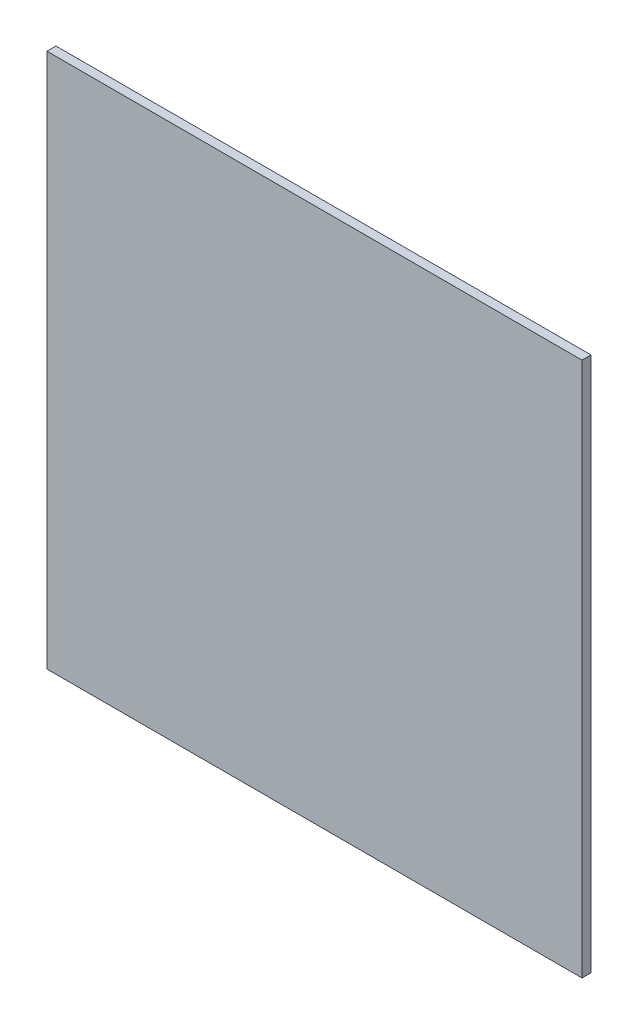
ISO-10303-21;
HEADER;
FILE_DESCRIPTION(('STEP AP214'),'2;1');
FILE_NAME('part.step','',(''),(''),'','','');
FILE_SCHEMA(('AUTOMOTIVE_DESIGN { 1 0 10303 214 1 1 1 1 }'));
ENDSEC;
DATA;
#1=APPLICATION_CONTEXT('core data for automotive mechanical design processes');
#2=APPLICATION_PROTOCOL_DEFINITION('international standard','automotive_design',2000,#1);
#3=PRODUCT_CONTEXT('',#1,'mechanical');
#4=PRODUCT('Part','Part','',(#3));
#5=PRODUCT_RELATED_PRODUCT_CATEGORY('part','',(#4));
#6=PRODUCT_DEFINITION_FORMATION('','',#4);
#7=PRODUCT_DEFINITION_CONTEXT('part definition',#1,'design');
#8=PRODUCT_DEFINITION('design','',#6,#7);
#9=PRODUCT_DEFINITION_SHAPE('','',#8);
#10=(LENGTH_UNIT() NAMED_UNIT(*) SI_UNIT(.MILLI.,.METRE.));
#11=(NAMED_UNIT(*) PLANE_ANGLE_UNIT() SI_UNIT($,.RADIAN.));
#12=(NAMED_UNIT(*) SI_UNIT($,.STERADIAN.) SOLID_ANGLE_UNIT());
#13=UNCERTAINTY_MEASURE_WITH_UNIT(LENGTH_MEASURE(1.E-05),#10,'distance_accuracy_value','');
#14=(GEOMETRIC_REPRESENTATION_CONTEXT(3) GLOBAL_UNCERTAINTY_ASSIGNED_CONTEXT((#13)) GLOBAL_UNIT_ASSIGNED_CONTEXT((#10,
#11,#12)) REPRESENTATION_CONTEXT('',''));
#15=CARTESIAN_POINT('',(0.,0.,0.));
#16=DIRECTION('',(0.,0.,1.));
#17=DIRECTION('',(1.,0.,0.));
#18=AXIS2_PLACEMENT_3D('',#15,#16,#17);
#19=CARTESIAN_POINT('',(-47.625,-47.625,1.6));
#20=DIRECTION('',(1.,0.,0.));
#21=DIRECTION('',(0.,0.,-1.));
#22=AXIS2_PLACEMENT_3D('',#19,#20,#21);
#23=PLANE('',#22);
#24=DIRECTION('',(0.,-1.,0.));
#25=VECTOR('',#24,1.);
#26=CARTESIAN_POINT('',(-47.625,-47.625,0.));
#27=LINE('',#26,#25);
#28=CARTESIAN_POINT('',(-47.625,47.625,0.));
#29=VERTEX_POINT('',#28);
#30=CARTESIAN_POINT('',(-47.625,-47.625,0.));
#31=VERTEX_POINT('',#30);
#32=EDGE_CURVE('E104',#29,#31,#27,.T.);
#33=ORIENTED_EDGE('',*,*,#32,.T.);
#34=DIRECTION('',(0.,0.,-1.));
#35=VECTOR('',#34,1.);
#36=CARTESIAN_POINT('',(-47.625,-47.625,1.6));
#37=LINE('',#36,#35);
#38=CARTESIAN_POINT('',(-47.625,-47.625,1.6));
#39=VERTEX_POINT('',#38);
#40=EDGE_CURVE('E11',#39,#31,#37,.T.);
#41=ORIENTED_EDGE('',*,*,#40,.F.);
#42=DIRECTION('',(0.,-1.,0.));
#43=VECTOR('',#42,1.);
#44=CARTESIAN_POINT('',(-47.625,-47.625,1.6));
#45=LINE('',#44,#43);
#46=CARTESIAN_POINT('',(-47.625,47.625,1.6));
#47=VERTEX_POINT('',#46);
#48=EDGE_CURVE('E92',#47,#39,#45,.T.);
#49=ORIENTED_EDGE('',*,*,#48,.F.);
#50=DIRECTION('',(0.,0.,-1.));
#51=VECTOR('',#50,1.);
#52=CARTESIAN_POINT('',(-47.625,47.625,1.6));
#53=LINE('',#52,#51);
#54=EDGE_CURVE('E100',#47,#29,#53,.T.);
#55=ORIENTED_EDGE('',*,*,#54,.T.);
#56=EDGE_LOOP('',(#33,#41,#49,#55));
#57=FACE_BOUND('',#56,.T.);
#58=ADVANCED_FACE('F41',(#57),#23,.F.);
#59=CARTESIAN_POINT('',(47.625,-47.625,1.6));
#60=DIRECTION('',(0.,1.,0.));
#61=DIRECTION('',(-1.,0.,0.));
#62=AXIS2_PLACEMENT_3D('',#59,#60,#61);
#63=PLANE('',#62);
#64=DIRECTION('',(1.,0.,0.));
#65=VECTOR('',#64,1.);
#66=CARTESIAN_POINT('',(47.625,-47.625,0.));
#67=LINE('',#66,#65);
#68=CARTESIAN_POINT('',(47.625,-47.625,0.));
#69=VERTEX_POINT('',#68);
#70=EDGE_CURVE('E96',#31,#69,#67,.T.);
#71=ORIENTED_EDGE('',*,*,#70,.T.);
#72=DIRECTION('',(0.,0.,-1.));
#73=VECTOR('',#72,1.);
#74=CARTESIAN_POINT('',(47.625,-47.625,1.6));
#75=LINE('',#74,#73);
#76=CARTESIAN_POINT('',(47.625,-47.625,1.6));
#77=VERTEX_POINT('',#76);
#78=EDGE_CURVE('E49',#77,#69,#75,.T.);
#79=ORIENTED_EDGE('',*,*,#78,.F.);
#80=DIRECTION('',(1.,0.,0.));
#81=VECTOR('',#80,1.);
#82=CARTESIAN_POINT('',(47.625,-47.625,1.6));
#83=LINE('',#82,#81);
#84=EDGE_CURVE('E87',#39,#77,#83,.T.);
#85=ORIENTED_EDGE('',*,*,#84,.F.);
#86=ORIENTED_EDGE('',*,*,#40,.T.);
#87=EDGE_LOOP('',(#71,#79,#85,#86));
#88=FACE_BOUND('',#87,.T.);
#89=ADVANCED_FACE('F95',(#88),#63,.F.);
#90=CARTESIAN_POINT('',(47.625,-47.625,1.6));
#91=DIRECTION('',(-1.,0.,0.));
#92=DIRECTION('',(0.,0.,1.));
#93=AXIS2_PLACEMENT_3D('',#90,#91,#92);
#94=PLANE('',#93);
#95=DIRECTION('',(0.,1.,0.));
#96=VECTOR('',#95,1.);
#97=CARTESIAN_POINT('',(47.625,-47.625,0.));
#98=LINE('',#97,#96);
#99=CARTESIAN_POINT('',(47.625,47.625,0.));
#100=VERTEX_POINT('',#99);
#101=EDGE_CURVE('E74',#69,#100,#98,.T.);
#102=ORIENTED_EDGE('',*,*,#101,.T.);
#103=DIRECTION('',(0.,0.,-1.));
#104=VECTOR('',#103,1.);
#105=CARTESIAN_POINT('',(47.625,47.625,1.6));
#106=LINE('',#105,#104);
#107=CARTESIAN_POINT('',(47.625,47.625,1.6));
#108=VERTEX_POINT('',#107);
#109=EDGE_CURVE('E97',#108,#100,#106,.T.);
#110=ORIENTED_EDGE('',*,*,#109,.F.);
#111=DIRECTION('',(0.,1.,0.));
#112=VECTOR('',#111,1.);
#113=CARTESIAN_POINT('',(47.625,-47.625,1.6));
#114=LINE('',#113,#112);
#115=EDGE_CURVE('E90',#77,#108,#114,.T.);
#116=ORIENTED_EDGE('',*,*,#115,.F.);
#117=ORIENTED_EDGE('',*,*,#78,.T.);
#118=EDGE_LOOP('',(#102,#110,#116,#117));
#119=FACE_BOUND('',#118,.T.);
#120=ADVANCED_FACE('F98',(#119),#94,.F.);
#121=CARTESIAN_POINT('',(47.625,47.625,1.6));
#122=DIRECTION('',(0.,-1.,0.));
#123=DIRECTION('',(1.,0.,0.));
#124=AXIS2_PLACEMENT_3D('',#121,#122,#123);
#125=PLANE('',#124);
#126=DIRECTION('',(-1.,0.,0.));
#127=VECTOR('',#126,1.);
#128=CARTESIAN_POINT('',(47.625,47.625,0.));
#129=LINE('',#128,#127);
#130=EDGE_CURVE('E80',#100,#29,#129,.T.);
#131=ORIENTED_EDGE('',*,*,#130,.T.);
#132=ORIENTED_EDGE('',*,*,#54,.F.);
#133=DIRECTION('',(-1.,0.,0.));
#134=VECTOR('',#133,1.);
#135=CARTESIAN_POINT('',(47.625,47.625,1.6));
#136=LINE('',#135,#134);
#137=EDGE_CURVE('E57',#108,#47,#136,.T.);
#138=ORIENTED_EDGE('',*,*,#137,.F.);
#139=ORIENTED_EDGE('',*,*,#109,.T.);
#140=EDGE_LOOP('',(#131,#132,#138,#139));
#141=FACE_BOUND('',#140,.T.);
#142=ADVANCED_FACE('F111',(#141),#125,.F.);
#143=CARTESIAN_POINT('',(0.,0.,1.6));
#144=DIRECTION('',(0.,0.,1.));
#145=DIRECTION('',(1.,0.,0.));
#146=AXIS2_PLACEMENT_3D('',#143,#144,#145);
#147=PLANE('',#146);
#148=ORIENTED_EDGE('',*,*,#48,.T.);
#149=ORIENTED_EDGE('',*,*,#84,.T.);
#150=ORIENTED_EDGE('',*,*,#115,.T.);
#151=ORIENTED_EDGE('',*,*,#137,.T.);
#152=EDGE_LOOP('',(#148,#149,#150,#151));
#153=FACE_BOUND('',#152,.T.);
#154=ADVANCED_FACE('F88',(#153),#147,.T.);
#155=CARTESIAN_POINT('',(0.,0.,0.));
#156=DIRECTION('',(0.,0.,1.));
#157=DIRECTION('',(1.,0.,0.));
#158=AXIS2_PLACEMENT_3D('',#155,#156,#157);
#159=PLANE('',#158);
#160=ORIENTED_EDGE('',*,*,#32,.F.);
#161=ORIENTED_EDGE('',*,*,#130,.F.);
#162=ORIENTED_EDGE('',*,*,#101,.F.);
#163=ORIENTED_EDGE('',*,*,#70,.F.);
#164=EDGE_LOOP('',(#160,#161,#162,#163));
#165=FACE_BOUND('',#164,.T.);
#166=ADVANCED_FACE('F114',(#165),#159,.F.);
#167=CLOSED_SHELL('',(#58,#89,#120,#142,#154,#166));
#168=MANIFOLD_SOLID_BREP('B2',#167);
#169=ADVANCED_BREP_SHAPE_REPRESENTATION('',(#18,#168),#14);
#170=SHAPE_DEFINITION_REPRESENTATION(#9,#169);
ENDSEC;
END-ISO-10303-21;
